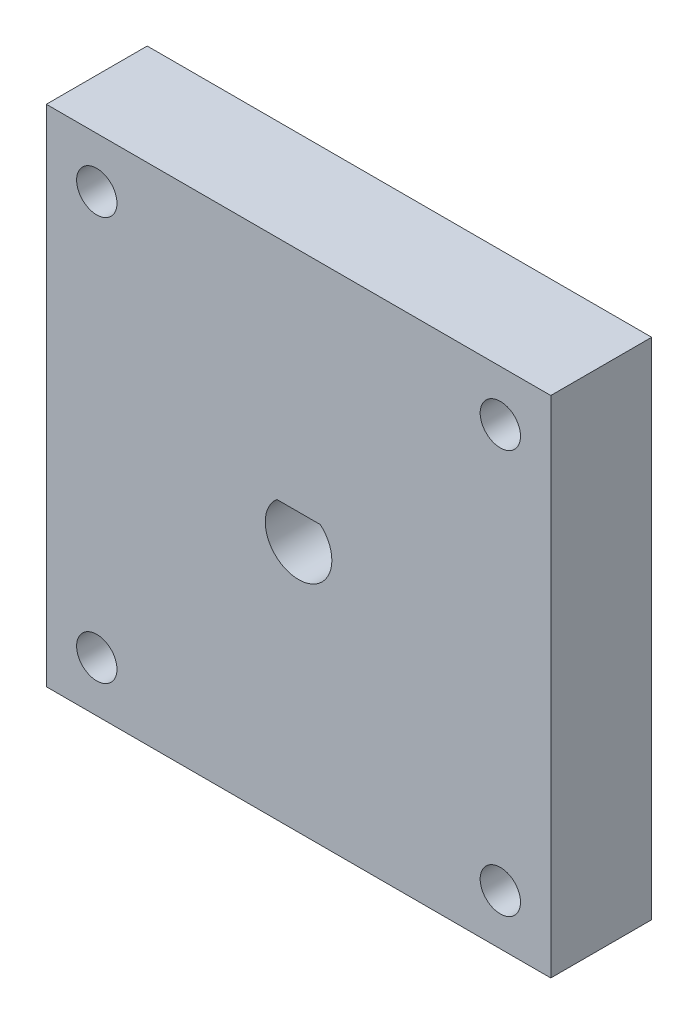
ISO-10303-21;
HEADER;
FILE_DESCRIPTION(('STEP AP214'),'2;1');
FILE_NAME('part.step','',(''),(''),'','','');
FILE_SCHEMA(('AUTOMOTIVE_DESIGN { 1 0 10303 214 1 1 1 1 }'));
ENDSEC;
DATA;
#1=APPLICATION_CONTEXT('core data for automotive mechanical design processes');
#2=APPLICATION_PROTOCOL_DEFINITION('international standard','automotive_design',2000,#1);
#3=PRODUCT_CONTEXT('',#1,'mechanical');
#4=PRODUCT('Part','Part','',(#3));
#5=PRODUCT_RELATED_PRODUCT_CATEGORY('part','',(#4));
#6=PRODUCT_DEFINITION_FORMATION('','',#4);
#7=PRODUCT_DEFINITION_CONTEXT('part definition',#1,'design');
#8=PRODUCT_DEFINITION('design','',#6,#7);
#9=PRODUCT_DEFINITION_SHAPE('','',#8);
#10=(LENGTH_UNIT() NAMED_UNIT(*) SI_UNIT(.MILLI.,.METRE.));
#11=(NAMED_UNIT(*) PLANE_ANGLE_UNIT() SI_UNIT($,.RADIAN.));
#12=(NAMED_UNIT(*) SI_UNIT($,.STERADIAN.) SOLID_ANGLE_UNIT());
#13=UNCERTAINTY_MEASURE_WITH_UNIT(LENGTH_MEASURE(1.E-05),#10,'distance_accuracy_value','');
#14=(GEOMETRIC_REPRESENTATION_CONTEXT(3) GLOBAL_UNCERTAINTY_ASSIGNED_CONTEXT((#13)) GLOBAL_UNIT_ASSIGNED_CONTEXT((#10,
#11,#12)) REPRESENTATION_CONTEXT('',''));
#15=CARTESIAN_POINT('',(0.,0.,0.));
#16=DIRECTION('',(0.,0.,1.));
#17=DIRECTION('',(1.,0.,0.));
#18=AXIS2_PLACEMENT_3D('',#15,#16,#17);
#19=CARTESIAN_POINT('',(0.,0.,10.));
#20=DIRECTION('',(0.,0.,-1.));
#21=DIRECTION('',(-1.,0.,0.));
#22=AXIS2_PLACEMENT_3D('',#19,#20,#21);
#23=PLANE('',#22);
#24=CARTESIAN_POINT('',(5.,5.,10.));
#25=DIRECTION('',(0.,0.,1.));
#26=DIRECTION('',(1.,0.,0.));
#27=AXIS2_PLACEMENT_3D('',#24,#25,#26);
#28=CIRCLE('',#27,2.);
#29=CARTESIAN_POINT('',(7.,5.,10.));
#30=VERTEX_POINT('',#29);
#31=EDGE_CURVE('E102',#30,#30,#28,.T.);
#32=ORIENTED_EDGE('',*,*,#31,.F.);
#33=EDGE_LOOP('',(#32));
#34=FACE_BOUND('',#33,.T.);
#35=CARTESIAN_POINT('',(45.,5.,10.));
#36=DIRECTION('',(0.,0.,1.));
#37=DIRECTION('',(1.,0.,0.));
#38=AXIS2_PLACEMENT_3D('',#35,#36,#37);
#39=CIRCLE('',#38,2.);
#40=CARTESIAN_POINT('',(47.,5.,10.));
#41=VERTEX_POINT('',#40);
#42=EDGE_CURVE('E108',#41,#41,#39,.T.);
#43=ORIENTED_EDGE('',*,*,#42,.F.);
#44=EDGE_LOOP('',(#43));
#45=FACE_BOUND('',#44,.T.);
#46=CARTESIAN_POINT('',(45.,45.,10.));
#47=DIRECTION('',(0.,0.,1.));
#48=DIRECTION('',(1.,0.,0.));
#49=AXIS2_PLACEMENT_3D('',#46,#47,#48);
#50=CIRCLE('',#49,2.);
#51=CARTESIAN_POINT('',(47.,45.,10.));
#52=VERTEX_POINT('',#51);
#53=EDGE_CURVE('E114',#52,#52,#50,.T.);
#54=ORIENTED_EDGE('',*,*,#53,.F.);
#55=EDGE_LOOP('',(#54));
#56=FACE_BOUND('',#55,.T.);
#57=CARTESIAN_POINT('',(5.,45.,10.));
#58=DIRECTION('',(0.,0.,1.));
#59=DIRECTION('',(1.,0.,0.));
#60=AXIS2_PLACEMENT_3D('',#57,#58,#59);
#61=CIRCLE('',#60,2.);
#62=CARTESIAN_POINT('',(7.,45.,10.));
#63=VERTEX_POINT('',#62);
#64=EDGE_CURVE('E120',#63,#63,#61,.T.);
#65=ORIENTED_EDGE('',*,*,#64,.F.);
#66=EDGE_LOOP('',(#65));
#67=FACE_BOUND('',#66,.T.);
#68=DIRECTION('',(0.,-1.,0.));
#69=VECTOR('',#68,1.);
#70=CARTESIAN_POINT('',(0.,0.,10.));
#71=LINE('',#70,#69);
#72=CARTESIAN_POINT('',(0.,50.,10.));
#73=VERTEX_POINT('',#72);
#74=CARTESIAN_POINT('',(0.,0.,10.));
#75=VERTEX_POINT('',#74);
#76=EDGE_CURVE('E126',#73,#75,#71,.T.);
#77=ORIENTED_EDGE('',*,*,#76,.T.);
#78=DIRECTION('',(1.,0.,0.));
#79=VECTOR('',#78,1.);
#80=CARTESIAN_POINT('',(0.,0.,10.));
#81=LINE('',#80,#79);
#82=CARTESIAN_POINT('',(50.,0.,10.));
#83=VERTEX_POINT('',#82);
#84=EDGE_CURVE('E129',#75,#83,#81,.T.);
#85=ORIENTED_EDGE('',*,*,#84,.T.);
#86=DIRECTION('',(0.,1.,0.));
#87=VECTOR('',#86,1.);
#88=CARTESIAN_POINT('',(50.,0.,10.));
#89=LINE('',#88,#87);
#90=CARTESIAN_POINT('',(50.,50.,10.));
#91=VERTEX_POINT('',#90);
#92=EDGE_CURVE('E132',#83,#91,#89,.T.);
#93=ORIENTED_EDGE('',*,*,#92,.T.);
#94=DIRECTION('',(-1.,0.,0.));
#95=VECTOR('',#94,1.);
#96=CARTESIAN_POINT('',(0.,50.,10.));
#97=LINE('',#96,#95);
#98=EDGE_CURVE('E134',#91,#73,#97,.T.);
#99=ORIENTED_EDGE('',*,*,#98,.T.);
#100=EDGE_LOOP('',(#77,#85,#93,#99));
#101=FACE_BOUND('',#100,.T.);
#102=CARTESIAN_POINT('',(25.,25.,10.));
#103=DIRECTION('',(0.,0.,1.));
#104=DIRECTION('',(1.,0.,0.));
#105=AXIS2_PLACEMENT_3D('',#102,#103,#104);
#106=CIRCLE('',#105,3.3);
#107=CARTESIAN_POINT('',(22.8459340771462,27.5,10.));
#108=VERTEX_POINT('',#107);
#109=CARTESIAN_POINT('',(27.1540659228538,27.5,10.));
#110=VERTEX_POINT('',#109);
#111=EDGE_CURVE('E91',#108,#110,#106,.T.);
#112=ORIENTED_EDGE('',*,*,#111,.F.);
#113=DIRECTION('',(-1.,0.,0.));
#114=VECTOR('',#113,1.);
#115=CARTESIAN_POINT('',(22.8459340771462,27.5,10.));
#116=LINE('',#115,#114);
#117=EDGE_CURVE('E85',#110,#108,#116,.T.);
#118=ORIENTED_EDGE('',*,*,#117,.F.);
#119=EDGE_LOOP('',(#112,#118));
#120=FACE_BOUND('',#119,.T.);
#121=ADVANCED_FACE('F33',(#34,#45,#56,#67,#101,#120),#23,.F.);
#122=CARTESIAN_POINT('',(0.,0.,0.));
#123=DIRECTION('',(0.,0.,-1.));
#124=DIRECTION('',(-1.,0.,0.));
#125=AXIS2_PLACEMENT_3D('',#122,#123,#124);
#126=PLANE('',#125);
#127=CARTESIAN_POINT('',(45.,5.,0.));
#128=DIRECTION('',(0.,0.,1.));
#129=DIRECTION('',(1.,0.,0.));
#130=AXIS2_PLACEMENT_3D('',#127,#128,#129);
#131=CIRCLE('',#130,2.);
#132=CARTESIAN_POINT('',(47.,5.,0.));
#133=VERTEX_POINT('',#132);
#134=EDGE_CURVE('E105',#133,#133,#131,.T.);
#135=ORIENTED_EDGE('',*,*,#134,.T.);
#136=EDGE_LOOP('',(#135));
#137=FACE_BOUND('',#136,.T.);
#138=CARTESIAN_POINT('',(5.,45.,0.));
#139=DIRECTION('',(0.,0.,1.));
#140=DIRECTION('',(1.,0.,0.));
#141=AXIS2_PLACEMENT_3D('',#138,#139,#140);
#142=CIRCLE('',#141,2.);
#143=CARTESIAN_POINT('',(7.,45.,0.));
#144=VERTEX_POINT('',#143);
#145=EDGE_CURVE('E117',#144,#144,#142,.T.);
#146=ORIENTED_EDGE('',*,*,#145,.T.);
#147=EDGE_LOOP('',(#146));
#148=FACE_BOUND('',#147,.T.);
#149=DIRECTION('',(0.,-1.,0.));
#150=VECTOR('',#149,1.);
#151=CARTESIAN_POINT('',(0.,0.,0.));
#152=LINE('',#151,#150);
#153=CARTESIAN_POINT('',(0.,50.,0.));
#154=VERTEX_POINT('',#153);
#155=CARTESIAN_POINT('',(0.,0.,0.));
#156=VERTEX_POINT('',#155);
#157=EDGE_CURVE('E123',#154,#156,#152,.T.);
#158=ORIENTED_EDGE('',*,*,#157,.F.);
#159=DIRECTION('',(-1.,0.,0.));
#160=VECTOR('',#159,1.);
#161=CARTESIAN_POINT('',(0.,50.,0.));
#162=LINE('',#161,#160);
#163=CARTESIAN_POINT('',(50.,50.,0.));
#164=VERTEX_POINT('',#163);
#165=EDGE_CURVE('E130',#164,#154,#162,.T.);
#166=ORIENTED_EDGE('',*,*,#165,.F.);
#167=DIRECTION('',(0.,1.,0.));
#168=VECTOR('',#167,1.);
#169=CARTESIAN_POINT('',(50.,0.,0.));
#170=LINE('',#169,#168);
#171=CARTESIAN_POINT('',(50.,0.,0.));
#172=VERTEX_POINT('',#171);
#173=EDGE_CURVE('E141',#172,#164,#170,.T.);
#174=ORIENTED_EDGE('',*,*,#173,.F.);
#175=DIRECTION('',(1.,0.,0.));
#176=VECTOR('',#175,1.);
#177=CARTESIAN_POINT('',(0.,0.,0.));
#178=LINE('',#177,#176);
#179=EDGE_CURVE('E139',#156,#172,#178,.T.);
#180=ORIENTED_EDGE('',*,*,#179,.F.);
#181=EDGE_LOOP('',(#158,#166,#174,#180));
#182=FACE_BOUND('',#181,.T.);
#183=CARTESIAN_POINT('',(45.,45.,0.));
#184=DIRECTION('',(0.,0.,1.));
#185=DIRECTION('',(1.,0.,0.));
#186=AXIS2_PLACEMENT_3D('',#183,#184,#185);
#187=CIRCLE('',#186,2.);
#188=CARTESIAN_POINT('',(47.,45.,0.));
#189=VERTEX_POINT('',#188);
#190=EDGE_CURVE('E111',#189,#189,#187,.T.);
#191=ORIENTED_EDGE('',*,*,#190,.T.);
#192=EDGE_LOOP('',(#191));
#193=FACE_BOUND('',#192,.T.);
#194=CARTESIAN_POINT('',(5.,5.,0.));
#195=DIRECTION('',(0.,0.,1.));
#196=DIRECTION('',(1.,0.,0.));
#197=AXIS2_PLACEMENT_3D('',#194,#195,#196);
#198=CIRCLE('',#197,2.);
#199=CARTESIAN_POINT('',(7.,5.,0.));
#200=VERTEX_POINT('',#199);
#201=EDGE_CURVE('E101',#200,#200,#198,.T.);
#202=ORIENTED_EDGE('',*,*,#201,.T.);
#203=EDGE_LOOP('',(#202));
#204=FACE_BOUND('',#203,.T.);
#205=DIRECTION('',(-1.,0.,0.));
#206=VECTOR('',#205,1.);
#207=CARTESIAN_POINT('',(22.8459340771462,27.5,0.));
#208=LINE('',#207,#206);
#209=CARTESIAN_POINT('',(27.1540659228538,27.5,0.));
#210=VERTEX_POINT('',#209);
#211=CARTESIAN_POINT('',(22.8459340771462,27.5,0.));
#212=VERTEX_POINT('',#211);
#213=EDGE_CURVE('E95',#210,#212,#208,.T.);
#214=ORIENTED_EDGE('',*,*,#213,.T.);
#215=CARTESIAN_POINT('',(25.,25.,0.));
#216=DIRECTION('',(0.,0.,1.));
#217=DIRECTION('',(1.,0.,0.));
#218=AXIS2_PLACEMENT_3D('',#215,#216,#217);
#219=CIRCLE('',#218,3.3);
#220=EDGE_CURVE('E55',#212,#210,#219,.T.);
#221=ORIENTED_EDGE('',*,*,#220,.T.);
#222=EDGE_LOOP('',(#214,#221));
#223=FACE_BOUND('',#222,.T.);
#224=ADVANCED_FACE('F159',(#137,#148,#182,#193,#204,#223),#126,.T.);
#225=CARTESIAN_POINT('',(0.,0.,10.));
#226=DIRECTION('',(1.,0.,0.));
#227=DIRECTION('',(0.,0.,-1.));
#228=AXIS2_PLACEMENT_3D('',#225,#226,#227);
#229=PLANE('',#228);
#230=ORIENTED_EDGE('',*,*,#157,.T.);
#231=DIRECTION('',(0.,0.,-1.));
#232=VECTOR('',#231,1.);
#233=CARTESIAN_POINT('',(0.,0.,10.));
#234=LINE('',#233,#232);
#235=EDGE_CURVE('E11',#75,#156,#234,.T.);
#236=ORIENTED_EDGE('',*,*,#235,.F.);
#237=ORIENTED_EDGE('',*,*,#76,.F.);
#238=DIRECTION('',(0.,0.,-1.));
#239=VECTOR('',#238,1.);
#240=CARTESIAN_POINT('',(0.,50.,10.));
#241=LINE('',#240,#239);
#242=EDGE_CURVE('E136',#73,#154,#241,.T.);
#243=ORIENTED_EDGE('',*,*,#242,.T.);
#244=EDGE_LOOP('',(#230,#236,#237,#243));
#245=FACE_BOUND('',#244,.T.);
#246=ADVANCED_FACE('F35',(#245),#229,.F.);
#247=CARTESIAN_POINT('',(0.,0.,10.));
#248=DIRECTION('',(0.,1.,0.));
#249=DIRECTION('',(0.,0.,1.));
#250=AXIS2_PLACEMENT_3D('',#247,#248,#249);
#251=PLANE('',#250);
#252=ORIENTED_EDGE('',*,*,#179,.T.);
#253=DIRECTION('',(0.,0.,-1.));
#254=VECTOR('',#253,1.);
#255=CARTESIAN_POINT('',(50.,0.,10.));
#256=LINE('',#255,#254);
#257=EDGE_CURVE('E41',#83,#172,#256,.T.);
#258=ORIENTED_EDGE('',*,*,#257,.F.);
#259=ORIENTED_EDGE('',*,*,#84,.F.);
#260=ORIENTED_EDGE('',*,*,#235,.T.);
#261=EDGE_LOOP('',(#252,#258,#259,#260));
#262=FACE_BOUND('',#261,.T.);
#263=ADVANCED_FACE('F169',(#262),#251,.F.);
#264=CARTESIAN_POINT('',(50.,0.,10.));
#265=DIRECTION('',(-1.,0.,0.));
#266=DIRECTION('',(0.,-1.,0.));
#267=AXIS2_PLACEMENT_3D('',#264,#265,#266);
#268=PLANE('',#267);
#269=ORIENTED_EDGE('',*,*,#173,.T.);
#270=DIRECTION('',(0.,0.,-1.));
#271=VECTOR('',#270,1.);
#272=CARTESIAN_POINT('',(50.,50.,10.));
#273=LINE('',#272,#271);
#274=EDGE_CURVE('E146',#91,#164,#273,.T.);
#275=ORIENTED_EDGE('',*,*,#274,.F.);
#276=ORIENTED_EDGE('',*,*,#92,.F.);
#277=ORIENTED_EDGE('',*,*,#257,.T.);
#278=EDGE_LOOP('',(#269,#275,#276,#277));
#279=FACE_BOUND('',#278,.T.);
#280=ADVANCED_FACE('F153',(#279),#268,.F.);
#281=CARTESIAN_POINT('',(0.,50.,10.));
#282=DIRECTION('',(0.,-1.,0.));
#283=DIRECTION('',(0.,0.,-1.));
#284=AXIS2_PLACEMENT_3D('',#281,#282,#283);
#285=PLANE('',#284);
#286=ORIENTED_EDGE('',*,*,#165,.T.);
#287=ORIENTED_EDGE('',*,*,#242,.F.);
#288=ORIENTED_EDGE('',*,*,#98,.F.);
#289=ORIENTED_EDGE('',*,*,#274,.T.);
#290=EDGE_LOOP('',(#286,#287,#288,#289));
#291=FACE_BOUND('',#290,.T.);
#292=ADVANCED_FACE('F163',(#291),#285,.F.);
#293=CARTESIAN_POINT('',(5.,45.,10.));
#294=DIRECTION('',(0.,0.,-1.));
#295=DIRECTION('',(-1.,0.,0.));
#296=AXIS2_PLACEMENT_3D('',#293,#294,#295);
#297=CYLINDRICAL_SURFACE('',#296,2.);
#298=ORIENTED_EDGE('',*,*,#64,.T.);
#299=EDGE_LOOP('',(#298));
#300=FACE_BOUND('',#299,.T.);
#301=ORIENTED_EDGE('',*,*,#145,.F.);
#302=EDGE_LOOP('',(#301));
#303=FACE_BOUND('',#302,.T.);
#304=ADVANCED_FACE('F187',(#300,#303),#297,.F.);
#305=CARTESIAN_POINT('',(45.,45.,10.));
#306=DIRECTION('',(0.,0.,-1.));
#307=DIRECTION('',(-1.,0.,0.));
#308=AXIS2_PLACEMENT_3D('',#305,#306,#307);
#309=CYLINDRICAL_SURFACE('',#308,2.);
#310=ORIENTED_EDGE('',*,*,#53,.T.);
#311=EDGE_LOOP('',(#310));
#312=FACE_BOUND('',#311,.T.);
#313=ORIENTED_EDGE('',*,*,#190,.F.);
#314=EDGE_LOOP('',(#313));
#315=FACE_BOUND('',#314,.T.);
#316=ADVANCED_FACE('F194',(#312,#315),#309,.F.);
#317=CARTESIAN_POINT('',(45.,5.,10.));
#318=DIRECTION('',(0.,0.,-1.));
#319=DIRECTION('',(-1.,0.,0.));
#320=AXIS2_PLACEMENT_3D('',#317,#318,#319);
#321=CYLINDRICAL_SURFACE('',#320,2.);
#322=ORIENTED_EDGE('',*,*,#42,.T.);
#323=EDGE_LOOP('',(#322));
#324=FACE_BOUND('',#323,.T.);
#325=ORIENTED_EDGE('',*,*,#134,.F.);
#326=EDGE_LOOP('',(#325));
#327=FACE_BOUND('',#326,.T.);
#328=ADVANCED_FACE('F199',(#324,#327),#321,.F.);
#329=CARTESIAN_POINT('',(5.,5.,10.));
#330=DIRECTION('',(0.,0.,-1.));
#331=DIRECTION('',(-1.,0.,0.));
#332=AXIS2_PLACEMENT_3D('',#329,#330,#331);
#333=CYLINDRICAL_SURFACE('',#332,2.);
#334=ORIENTED_EDGE('',*,*,#31,.T.);
#335=EDGE_LOOP('',(#334));
#336=FACE_BOUND('',#335,.T.);
#337=ORIENTED_EDGE('',*,*,#201,.F.);
#338=EDGE_LOOP('',(#337));
#339=FACE_BOUND('',#338,.T.);
#340=ADVANCED_FACE('F209',(#336,#339),#333,.F.);
#341=CARTESIAN_POINT('',(25.,25.,10.));
#342=DIRECTION('',(0.,0.,-1.));
#343=DIRECTION('',(-1.,0.,0.));
#344=AXIS2_PLACEMENT_3D('',#341,#342,#343);
#345=CYLINDRICAL_SURFACE('',#344,3.3);
#346=ORIENTED_EDGE('',*,*,#220,.F.);
#347=DIRECTION('',(0.,0.,-1.));
#348=VECTOR('',#347,1.);
#349=CARTESIAN_POINT('',(22.8459340771462,27.5,10.));
#350=LINE('',#349,#348);
#351=EDGE_CURVE('E87',#108,#212,#350,.T.);
#352=ORIENTED_EDGE('',*,*,#351,.F.);
#353=ORIENTED_EDGE('',*,*,#111,.T.);
#354=DIRECTION('',(0.,0.,-1.));
#355=VECTOR('',#354,1.);
#356=CARTESIAN_POINT('',(27.1540659228538,27.5,10.));
#357=LINE('',#356,#355);
#358=EDGE_CURVE('E48',#110,#210,#357,.T.);
#359=ORIENTED_EDGE('',*,*,#358,.T.);
#360=EDGE_LOOP('',(#346,#352,#353,#359));
#361=FACE_BOUND('',#360,.T.);
#362=ADVANCED_FACE('F93',(#361),#345,.F.);
#363=CARTESIAN_POINT('',(22.8459340771462,27.5,10.));
#364=DIRECTION('',(0.,-1.,0.));
#365=DIRECTION('',(0.,0.,-1.));
#366=AXIS2_PLACEMENT_3D('',#363,#364,#365);
#367=PLANE('',#366);
#368=ORIENTED_EDGE('',*,*,#213,.F.);
#369=ORIENTED_EDGE('',*,*,#358,.F.);
#370=ORIENTED_EDGE('',*,*,#117,.T.);
#371=ORIENTED_EDGE('',*,*,#351,.T.);
#372=EDGE_LOOP('',(#368,#369,#370,#371));
#373=FACE_BOUND('',#372,.T.);
#374=ADVANCED_FACE('F86',(#373),#367,.T.);
#375=CLOSED_SHELL('',(#121,#224,#246,#263,#280,#292,#304,#316,#328,#340,#362,#374));
#376=MANIFOLD_SOLID_BREP('B2',#375);
#377=ADVANCED_BREP_SHAPE_REPRESENTATION('',(#18,#376),#14);
#378=SHAPE_DEFINITION_REPRESENTATION(#9,#377);
ENDSEC;
END-ISO-10303-21;
